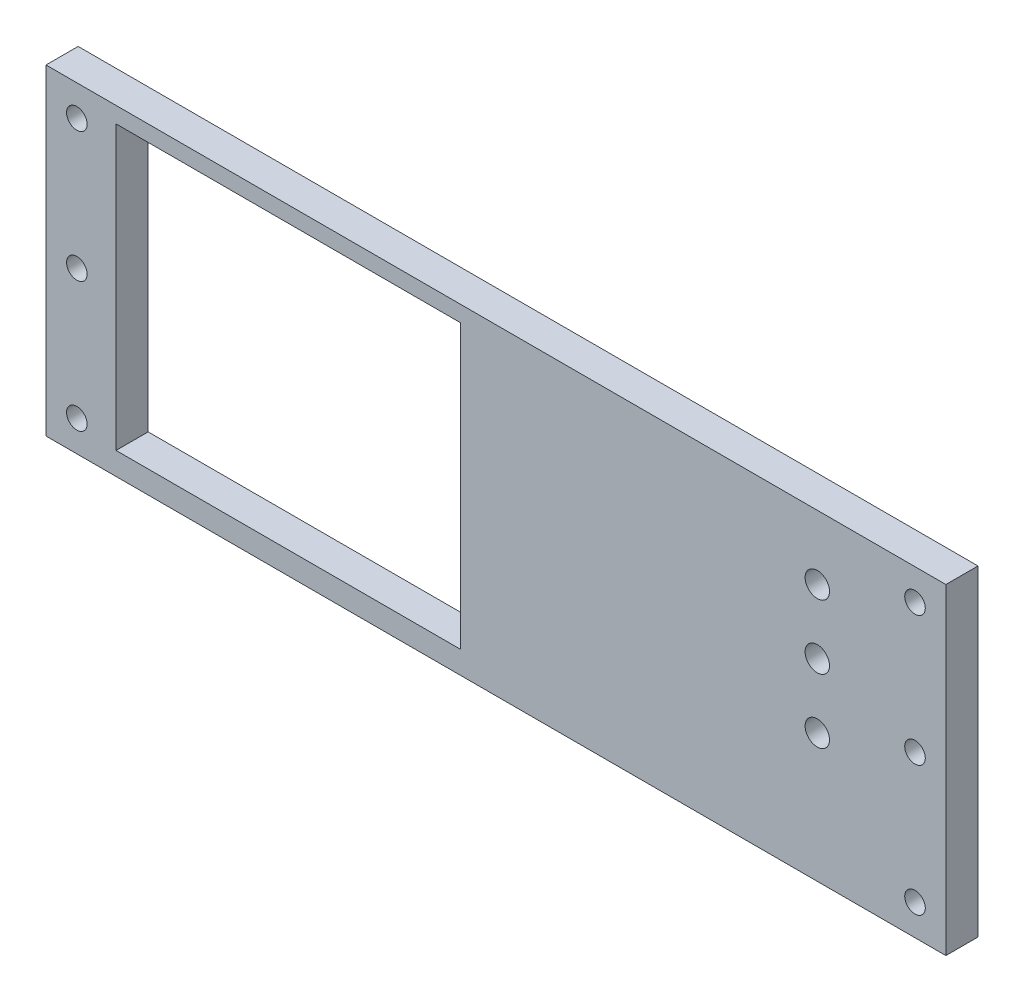
ISO-10303-21;
HEADER;
FILE_DESCRIPTION(('STEP AP214'),'2;1');
FILE_NAME('part.step','',(''),(''),'','','');
FILE_SCHEMA(('AUTOMOTIVE_DESIGN { 1 0 10303 214 1 1 1 1 }'));
ENDSEC;
DATA;
#1=APPLICATION_CONTEXT('core data for automotive mechanical design processes');
#2=APPLICATION_PROTOCOL_DEFINITION('international standard','automotive_design',2000,#1);
#3=PRODUCT_CONTEXT('',#1,'mechanical');
#4=PRODUCT('Part','Part','',(#3));
#5=PRODUCT_RELATED_PRODUCT_CATEGORY('part','',(#4));
#6=PRODUCT_DEFINITION_FORMATION('','',#4);
#7=PRODUCT_DEFINITION_CONTEXT('part definition',#1,'design');
#8=PRODUCT_DEFINITION('design','',#6,#7);
#9=PRODUCT_DEFINITION_SHAPE('','',#8);
#10=(LENGTH_UNIT() NAMED_UNIT(*) SI_UNIT(.MILLI.,.METRE.));
#11=(NAMED_UNIT(*) PLANE_ANGLE_UNIT() SI_UNIT($,.RADIAN.));
#12=(NAMED_UNIT(*) SI_UNIT($,.STERADIAN.) SOLID_ANGLE_UNIT());
#13=UNCERTAINTY_MEASURE_WITH_UNIT(LENGTH_MEASURE(1.E-05),#10,'distance_accuracy_value','');
#14=(GEOMETRIC_REPRESENTATION_CONTEXT(3) GLOBAL_UNCERTAINTY_ASSIGNED_CONTEXT((#13)) GLOBAL_UNIT_ASSIGNED_CONTEXT((#10,
#11,#12)) REPRESENTATION_CONTEXT('',''));
#15=CARTESIAN_POINT('',(0.,0.,0.));
#16=DIRECTION('',(0.,0.,1.));
#17=DIRECTION('',(1.,0.,0.));
#18=AXIS2_PLACEMENT_3D('',#15,#16,#17);
#19=CARTESIAN_POINT('',(63.5,-6.35000000000002,0.));
#20=DIRECTION('',(0.,0.,1.));
#21=DIRECTION('',(1.,0.,0.));
#22=AXIS2_PLACEMENT_3D('',#19,#20,#21);
#23=CYLINDRICAL_SURFACE('',#22,2.413);
#24=CARTESIAN_POINT('',(63.5,-6.35000000000002,0.));
#25=DIRECTION('',(0.,0.,1.));
#26=DIRECTION('',(1.,0.,0.));
#27=AXIS2_PLACEMENT_3D('',#24,#25,#26);
#28=CIRCLE('',#27,2.413);
#29=CARTESIAN_POINT('',(65.913,-6.35000000000002,0.));
#30=VERTEX_POINT('',#29);
#31=EDGE_CURVE('E45',#30,#30,#28,.T.);
#32=ORIENTED_EDGE('',*,*,#31,.F.);
#33=EDGE_LOOP('',(#32));
#34=FACE_BOUND('',#33,.T.);
#35=CARTESIAN_POINT('',(63.5,-6.35000000000002,6.35));
#36=DIRECTION('',(0.,0.,1.));
#37=DIRECTION('',(1.,0.,0.));
#38=AXIS2_PLACEMENT_3D('',#35,#36,#37);
#39=CIRCLE('',#38,2.413);
#40=CARTESIAN_POINT('',(65.913,-6.35000000000002,6.35));
#41=VERTEX_POINT('',#40);
#42=EDGE_CURVE('E12',#41,#41,#39,.T.);
#43=ORIENTED_EDGE('',*,*,#42,.T.);
#44=EDGE_LOOP('',(#43));
#45=FACE_BOUND('',#44,.T.);
#46=ADVANCED_FACE('F38',(#34,#45),#23,.F.);
#47=CARTESIAN_POINT('',(0.,-31.75,6.35));
#48=DIRECTION('',(0.,1.,0.));
#49=DIRECTION('',(0.,0.,1.));
#50=AXIS2_PLACEMENT_3D('',#47,#48,#49);
#51=PLANE('',#50);
#52=DIRECTION('',(1.,0.,0.));
#53=VECTOR('',#52,1.);
#54=CARTESIAN_POINT('',(0.,-31.75,0.));
#55=LINE('',#54,#53);
#56=CARTESIAN_POINT('',(-88.9,-31.75,0.));
#57=VERTEX_POINT('',#56);
#58=CARTESIAN_POINT('',(88.9,-31.75,0.));
#59=VERTEX_POINT('',#58);
#60=EDGE_CURVE('E185',#57,#59,#55,.T.);
#61=ORIENTED_EDGE('',*,*,#60,.T.);
#62=DIRECTION('',(0.,0.,-1.));
#63=VECTOR('',#62,1.);
#64=CARTESIAN_POINT('',(88.9,-31.75,6.35));
#65=LINE('',#64,#63);
#66=CARTESIAN_POINT('',(88.9,-31.75,6.35));
#67=VERTEX_POINT('',#66);
#68=EDGE_CURVE('E216',#67,#59,#65,.T.);
#69=ORIENTED_EDGE('',*,*,#68,.F.);
#70=DIRECTION('',(1.,0.,0.));
#71=VECTOR('',#70,1.);
#72=CARTESIAN_POINT('',(0.,-31.75,6.35));
#73=LINE('',#72,#71);
#74=CARTESIAN_POINT('',(-88.9,-31.75,6.35));
#75=VERTEX_POINT('',#74);
#76=EDGE_CURVE('E144',#75,#67,#73,.T.);
#77=ORIENTED_EDGE('',*,*,#76,.F.);
#78=DIRECTION('',(0.,0.,-1.));
#79=VECTOR('',#78,1.);
#80=CARTESIAN_POINT('',(-88.9,-31.75,6.35));
#81=LINE('',#80,#79);
#82=EDGE_CURVE('E182',#75,#57,#81,.T.);
#83=ORIENTED_EDGE('',*,*,#82,.T.);
#84=EDGE_LOOP('',(#61,#69,#77,#83));
#85=FACE_BOUND('',#84,.T.);
#86=ADVANCED_FACE('F224',(#85),#51,.F.);
#87=CARTESIAN_POINT('',(88.9,0.,6.35));
#88=DIRECTION('',(-1.,0.,0.));
#89=DIRECTION('',(0.,0.,1.));
#90=AXIS2_PLACEMENT_3D('',#87,#88,#89);
#91=PLANE('',#90);
#92=DIRECTION('',(0.,1.,0.));
#93=VECTOR('',#92,1.);
#94=CARTESIAN_POINT('',(88.9,0.,0.));
#95=LINE('',#94,#93);
#96=CARTESIAN_POINT('',(88.9,31.75,0.));
#97=VERTEX_POINT('',#96);
#98=EDGE_CURVE('E188',#59,#97,#95,.T.);
#99=ORIENTED_EDGE('',*,*,#98,.T.);
#100=DIRECTION('',(0.,0.,-1.));
#101=VECTOR('',#100,1.);
#102=CARTESIAN_POINT('',(88.9,31.75,6.35));
#103=LINE('',#102,#101);
#104=CARTESIAN_POINT('',(88.9,31.75,6.35));
#105=VERTEX_POINT('',#104);
#106=EDGE_CURVE('E214',#105,#97,#103,.T.);
#107=ORIENTED_EDGE('',*,*,#106,.F.);
#108=DIRECTION('',(0.,1.,0.));
#109=VECTOR('',#108,1.);
#110=CARTESIAN_POINT('',(88.9,0.,6.35));
#111=LINE('',#110,#109);
#112=EDGE_CURVE('E149',#67,#105,#111,.T.);
#113=ORIENTED_EDGE('',*,*,#112,.F.);
#114=ORIENTED_EDGE('',*,*,#68,.T.);
#115=EDGE_LOOP('',(#99,#107,#113,#114));
#116=FACE_BOUND('',#115,.T.);
#117=ADVANCED_FACE('F270',(#116),#91,.F.);
#118=CARTESIAN_POINT('',(0.,31.75,6.35));
#119=DIRECTION('',(0.,1.,0.));
#120=DIRECTION('',(0.,0.,1.));
#121=AXIS2_PLACEMENT_3D('',#118,#119,#120);
#122=PLANE('',#121);
#123=DIRECTION('',(1.,0.,0.));
#124=VECTOR('',#123,1.);
#125=CARTESIAN_POINT('',(0.,31.75,0.));
#126=LINE('',#125,#124);
#127=CARTESIAN_POINT('',(-88.9,31.75,0.));
#128=VERTEX_POINT('',#127);
#129=EDGE_CURVE('E191',#128,#97,#126,.T.);
#130=ORIENTED_EDGE('',*,*,#129,.F.);
#131=DIRECTION('',(0.,0.,-1.));
#132=VECTOR('',#131,1.);
#133=CARTESIAN_POINT('',(-88.9,31.75,6.35));
#134=LINE('',#133,#132);
#135=CARTESIAN_POINT('',(-88.9,31.75,6.35));
#136=VERTEX_POINT('',#135);
#137=EDGE_CURVE('E212',#136,#128,#134,.T.);
#138=ORIENTED_EDGE('',*,*,#137,.F.);
#139=DIRECTION('',(1.,0.,0.));
#140=VECTOR('',#139,1.);
#141=CARTESIAN_POINT('',(0.,31.75,6.35));
#142=LINE('',#141,#140);
#143=EDGE_CURVE('E158',#136,#105,#142,.T.);
#144=ORIENTED_EDGE('',*,*,#143,.T.);
#145=ORIENTED_EDGE('',*,*,#106,.T.);
#146=EDGE_LOOP('',(#130,#138,#144,#145));
#147=FACE_BOUND('',#146,.T.);
#148=ADVANCED_FACE('F251',(#147),#122,.T.);
#149=CARTESIAN_POINT('',(82.8039999999995,-25.654,6.35));
#150=DIRECTION('',(0.,0.,-1.));
#151=DIRECTION('',(-1.,0.,0.));
#152=AXIS2_PLACEMENT_3D('',#149,#150,#151);
#153=CYLINDRICAL_SURFACE('',#152,2.03200000000001);
#154=CARTESIAN_POINT('',(82.8039999999995,-25.654,6.35));
#155=DIRECTION('',(0.,0.,1.));
#156=DIRECTION('',(1.,0.,0.));
#157=AXIS2_PLACEMENT_3D('',#154,#155,#156);
#158=CIRCLE('',#157,2.03200000000001);
#159=CARTESIAN_POINT('',(84.8359999999995,-25.654,6.35));
#160=VERTEX_POINT('',#159);
#161=EDGE_CURVE('E176',#160,#160,#158,.F.);
#162=ORIENTED_EDGE('',*,*,#161,.F.);
#163=EDGE_LOOP('',(#162));
#164=FACE_BOUND('',#163,.T.);
#165=CARTESIAN_POINT('',(82.8039999999995,-25.654,0.));
#166=DIRECTION('',(0.,0.,1.));
#167=DIRECTION('',(1.,0.,0.));
#168=AXIS2_PLACEMENT_3D('',#165,#166,#167);
#169=CIRCLE('',#168,2.03200000000001);
#170=CARTESIAN_POINT('',(84.8359999999995,-25.654,0.));
#171=VERTEX_POINT('',#170);
#172=EDGE_CURVE('E206',#171,#171,#169,.F.);
#173=ORIENTED_EDGE('',*,*,#172,.T.);
#174=EDGE_LOOP('',(#173));
#175=FACE_BOUND('',#174,.T.);
#176=ADVANCED_FACE('F247',(#164,#175),#153,.F.);
#177=CARTESIAN_POINT('',(-82.8039999999995,-25.654,6.35));
#178=DIRECTION('',(0.,0.,-1.));
#179=DIRECTION('',(-1.,0.,0.));
#180=AXIS2_PLACEMENT_3D('',#177,#178,#179);
#181=CYLINDRICAL_SURFACE('',#180,2.03200000000001);
#182=CARTESIAN_POINT('',(-82.8039999999995,-25.654,6.35));
#183=DIRECTION('',(0.,0.,1.));
#184=DIRECTION('',(1.,0.,0.));
#185=AXIS2_PLACEMENT_3D('',#182,#183,#184);
#186=CIRCLE('',#185,2.03200000000001);
#187=CARTESIAN_POINT('',(-80.7719999999995,-25.654,6.35));
#188=VERTEX_POINT('',#187);
#189=EDGE_CURVE('E172',#188,#188,#186,.T.);
#190=ORIENTED_EDGE('',*,*,#189,.T.);
#191=EDGE_LOOP('',(#190));
#192=FACE_BOUND('',#191,.T.);
#193=CARTESIAN_POINT('',(-82.8039999999995,-25.654,0.));
#194=DIRECTION('',(0.,0.,1.));
#195=DIRECTION('',(1.,0.,0.));
#196=AXIS2_PLACEMENT_3D('',#193,#194,#195);
#197=CIRCLE('',#196,2.03200000000001);
#198=CARTESIAN_POINT('',(-80.7719999999995,-25.654,0.));
#199=VERTEX_POINT('',#198);
#200=EDGE_CURVE('E203',#199,#199,#197,.T.);
#201=ORIENTED_EDGE('',*,*,#200,.F.);
#202=EDGE_LOOP('',(#201));
#203=FACE_BOUND('',#202,.T.);
#204=ADVANCED_FACE('F250',(#192,#203),#181,.F.);
#205=CARTESIAN_POINT('',(-82.8039999999997,0.,6.35));
#206=DIRECTION('',(0.,0.,-1.));
#207=DIRECTION('',(-1.,0.,0.));
#208=AXIS2_PLACEMENT_3D('',#205,#206,#207);
#209=CYLINDRICAL_SURFACE('',#208,2.03200000000001);
#210=CARTESIAN_POINT('',(-82.8039999999997,0.,6.35));
#211=DIRECTION('',(0.,0.,1.));
#212=DIRECTION('',(1.,0.,0.));
#213=AXIS2_PLACEMENT_3D('',#210,#211,#212);
#214=CIRCLE('',#213,2.03200000000001);
#215=CARTESIAN_POINT('',(-80.7719999999997,0.,6.35));
#216=VERTEX_POINT('',#215);
#217=EDGE_CURVE('E169',#216,#216,#214,.T.);
#218=ORIENTED_EDGE('',*,*,#217,.T.);
#219=EDGE_LOOP('',(#218));
#220=FACE_BOUND('',#219,.T.);
#221=CARTESIAN_POINT('',(-82.8039999999997,0.,0.));
#222=DIRECTION('',(0.,0.,1.));
#223=DIRECTION('',(1.,0.,0.));
#224=AXIS2_PLACEMENT_3D('',#221,#222,#223);
#225=CIRCLE('',#224,2.03200000000001);
#226=CARTESIAN_POINT('',(-80.7719999999997,0.,0.));
#227=VERTEX_POINT('',#226);
#228=EDGE_CURVE('E200',#227,#227,#225,.T.);
#229=ORIENTED_EDGE('',*,*,#228,.F.);
#230=EDGE_LOOP('',(#229));
#231=FACE_BOUND('',#230,.T.);
#232=ADVANCED_FACE('F255',(#220,#231),#209,.F.);
#233=CARTESIAN_POINT('',(-82.804,25.654,6.35));
#234=DIRECTION('',(0.,0.,-1.));
#235=DIRECTION('',(-1.,0.,0.));
#236=AXIS2_PLACEMENT_3D('',#233,#234,#235);
#237=CYLINDRICAL_SURFACE('',#236,2.03200000000001);
#238=CARTESIAN_POINT('',(-82.804,25.654,6.35));
#239=DIRECTION('',(0.,0.,1.));
#240=DIRECTION('',(1.,0.,0.));
#241=AXIS2_PLACEMENT_3D('',#238,#239,#240);
#242=CIRCLE('',#241,2.03200000000001);
#243=CARTESIAN_POINT('',(-80.772,25.654,6.35));
#244=VERTEX_POINT('',#243);
#245=EDGE_CURVE('E165',#244,#244,#242,.T.);
#246=ORIENTED_EDGE('',*,*,#245,.T.);
#247=EDGE_LOOP('',(#246));
#248=FACE_BOUND('',#247,.T.);
#249=CARTESIAN_POINT('',(-82.804,25.654,0.));
#250=DIRECTION('',(0.,0.,1.));
#251=DIRECTION('',(1.,0.,0.));
#252=AXIS2_PLACEMENT_3D('',#249,#250,#251);
#253=CIRCLE('',#252,2.03200000000001);
#254=CARTESIAN_POINT('',(-80.772,25.654,0.));
#255=VERTEX_POINT('',#254);
#256=EDGE_CURVE('E197',#255,#255,#253,.T.);
#257=ORIENTED_EDGE('',*,*,#256,.F.);
#258=EDGE_LOOP('',(#257));
#259=FACE_BOUND('',#258,.T.);
#260=ADVANCED_FACE('F259',(#248,#259),#237,.F.);
#261=CARTESIAN_POINT('',(-88.9,0.,6.35));
#262=DIRECTION('',(-1.,0.,0.));
#263=DIRECTION('',(0.,0.,1.));
#264=AXIS2_PLACEMENT_3D('',#261,#262,#263);
#265=PLANE('',#264);
#266=DIRECTION('',(0.,1.,0.));
#267=VECTOR('',#266,1.);
#268=CARTESIAN_POINT('',(-88.9,0.,0.));
#269=LINE('',#268,#267);
#270=EDGE_CURVE('E194',#57,#128,#269,.T.);
#271=ORIENTED_EDGE('',*,*,#270,.F.);
#272=ORIENTED_EDGE('',*,*,#82,.F.);
#273=DIRECTION('',(0.,1.,0.));
#274=VECTOR('',#273,1.);
#275=CARTESIAN_POINT('',(-88.9,0.,6.35));
#276=LINE('',#275,#274);
#277=EDGE_CURVE('E161',#75,#136,#276,.T.);
#278=ORIENTED_EDGE('',*,*,#277,.T.);
#279=ORIENTED_EDGE('',*,*,#137,.T.);
#280=EDGE_LOOP('',(#271,#272,#278,#279));
#281=FACE_BOUND('',#280,.T.);
#282=ADVANCED_FACE('F263',(#281),#265,.T.);
#283=CARTESIAN_POINT('',(82.8039999999997,0.,6.35));
#284=DIRECTION('',(0.,0.,-1.));
#285=DIRECTION('',(-1.,0.,0.));
#286=AXIS2_PLACEMENT_3D('',#283,#284,#285);
#287=CYLINDRICAL_SURFACE('',#286,2.03200000000001);
#288=CARTESIAN_POINT('',(82.8039999999997,0.,6.35));
#289=DIRECTION('',(0.,0.,1.));
#290=DIRECTION('',(1.,0.,0.));
#291=AXIS2_PLACEMENT_3D('',#288,#289,#290);
#292=CIRCLE('',#291,2.03200000000001);
#293=CARTESIAN_POINT('',(84.8359999999997,0.,6.35));
#294=VERTEX_POINT('',#293);
#295=EDGE_CURVE('E141',#294,#294,#292,.F.);
#296=ORIENTED_EDGE('',*,*,#295,.F.);
#297=EDGE_LOOP('',(#296));
#298=FACE_BOUND('',#297,.T.);
#299=CARTESIAN_POINT('',(82.8039999999997,0.,0.));
#300=DIRECTION('',(0.,0.,1.));
#301=DIRECTION('',(1.,0.,0.));
#302=AXIS2_PLACEMENT_3D('',#299,#300,#301);
#303=CIRCLE('',#302,2.03200000000001);
#304=CARTESIAN_POINT('',(84.8359999999997,0.,0.));
#305=VERTEX_POINT('',#304);
#306=EDGE_CURVE('E137',#305,#305,#303,.F.);
#307=ORIENTED_EDGE('',*,*,#306,.T.);
#308=EDGE_LOOP('',(#307));
#309=FACE_BOUND('',#308,.T.);
#310=ADVANCED_FACE('F239',(#298,#309),#287,.F.);
#311=CARTESIAN_POINT('',(82.804,25.654,6.35));
#312=DIRECTION('',(0.,0.,-1.));
#313=DIRECTION('',(-1.,0.,0.));
#314=AXIS2_PLACEMENT_3D('',#311,#312,#313);
#315=CYLINDRICAL_SURFACE('',#314,2.03200000000001);
#316=CARTESIAN_POINT('',(82.804,25.654,6.35));
#317=DIRECTION('',(0.,0.,1.));
#318=DIRECTION('',(1.,0.,0.));
#319=AXIS2_PLACEMENT_3D('',#316,#317,#318);
#320=CIRCLE('',#319,2.03200000000001);
#321=CARTESIAN_POINT('',(84.836,25.654,6.35));
#322=VERTEX_POINT('',#321);
#323=EDGE_CURVE('E179',#322,#322,#320,.F.);
#324=ORIENTED_EDGE('',*,*,#323,.F.);
#325=EDGE_LOOP('',(#324));
#326=FACE_BOUND('',#325,.T.);
#327=CARTESIAN_POINT('',(82.804,25.654,0.));
#328=DIRECTION('',(0.,0.,1.));
#329=DIRECTION('',(1.,0.,0.));
#330=AXIS2_PLACEMENT_3D('',#327,#328,#329);
#331=CIRCLE('',#330,2.03200000000001);
#332=CARTESIAN_POINT('',(84.836,25.654,0.));
#333=VERTEX_POINT('',#332);
#334=EDGE_CURVE('E145',#333,#333,#331,.F.);
#335=ORIENTED_EDGE('',*,*,#334,.T.);
#336=EDGE_LOOP('',(#335));
#337=FACE_BOUND('',#336,.T.);
#338=ADVANCED_FACE('F229',(#326,#337),#315,.F.);
#339=CARTESIAN_POINT('',(0.,0.,6.35));
#340=DIRECTION('',(0.,0.,1.));
#341=DIRECTION('',(1.,0.,0.));
#342=AXIS2_PLACEMENT_3D('',#339,#340,#341);
#343=PLANE('',#342);
#344=CARTESIAN_POINT('',(63.5,6.34999999999998,6.35));
#345=DIRECTION('',(0.,0.,1.));
#346=DIRECTION('',(1.,0.,0.));
#347=AXIS2_PLACEMENT_3D('',#344,#345,#346);
#348=CIRCLE('',#347,2.413);
#349=CARTESIAN_POINT('',(65.913,6.34999999999998,6.35));
#350=VERTEX_POINT('',#349);
#351=EDGE_CURVE('E402',#350,#350,#348,.T.);
#352=ORIENTED_EDGE('',*,*,#351,.F.);
#353=EDGE_LOOP('',(#352));
#354=FACE_BOUND('',#353,.T.);
#355=CARTESIAN_POINT('',(63.5,19.05,6.35));
#356=DIRECTION('',(0.,0.,1.));
#357=DIRECTION('',(1.,0.,0.));
#358=AXIS2_PLACEMENT_3D('',#355,#356,#357);
#359=CIRCLE('',#358,2.413);
#360=CARTESIAN_POINT('',(65.913,19.05,6.35));
#361=VERTEX_POINT('',#360);
#362=EDGE_CURVE('E124',#361,#361,#359,.T.);
#363=ORIENTED_EDGE('',*,*,#362,.F.);
#364=EDGE_LOOP('',(#363));
#365=FACE_BOUND('',#364,.T.);
#366=DIRECTION('',(1.,0.,0.));
#367=VECTOR('',#366,1.);
#368=CARTESIAN_POINT('',(0.,-27.2904709288165,6.35));
#369=LINE('',#368,#367);
#370=CARTESIAN_POINT('',(-75.0631835888811,-27.2904709288165,6.35));
#371=VERTEX_POINT('',#370);
#372=CARTESIAN_POINT('',(-7.03193606446462,-27.2904709288165,6.35));
#373=VERTEX_POINT('',#372);
#374=EDGE_CURVE('E52',#371,#373,#369,.T.);
#375=ORIENTED_EDGE('',*,*,#374,.F.);
#376=DIRECTION('',(0.,1.,0.));
#377=VECTOR('',#376,1.);
#378=CARTESIAN_POINT('',(-75.0631835888811,0.,6.35));
#379=LINE('',#378,#377);
#380=CARTESIAN_POINT('',(-75.0631835888811,28.5895290711835,6.35));
#381=VERTEX_POINT('',#380);
#382=EDGE_CURVE('E118',#371,#381,#379,.T.);
#383=ORIENTED_EDGE('',*,*,#382,.T.);
#384=DIRECTION('',(1.,0.,0.));
#385=VECTOR('',#384,1.);
#386=CARTESIAN_POINT('',(0.,28.5895290711835,6.35));
#387=LINE('',#386,#385);
#388=CARTESIAN_POINT('',(-7.03193606446462,28.5895290711835,6.35));
#389=VERTEX_POINT('',#388);
#390=EDGE_CURVE('E121',#381,#389,#387,.T.);
#391=ORIENTED_EDGE('',*,*,#390,.T.);
#392=DIRECTION('',(0.,1.,0.));
#393=VECTOR('',#392,1.);
#394=CARTESIAN_POINT('',(-7.03193606446462,0.,6.35));
#395=LINE('',#394,#393);
#396=EDGE_CURVE('E130',#373,#389,#395,.T.);
#397=ORIENTED_EDGE('',*,*,#396,.F.);
#398=EDGE_LOOP('',(#375,#383,#391,#397));
#399=FACE_BOUND('',#398,.T.);
#400=ORIENTED_EDGE('',*,*,#295,.T.);
#401=EDGE_LOOP('',(#400));
#402=FACE_BOUND('',#401,.T.);
#403=ORIENTED_EDGE('',*,*,#76,.T.);
#404=ORIENTED_EDGE('',*,*,#112,.T.);
#405=ORIENTED_EDGE('',*,*,#143,.F.);
#406=ORIENTED_EDGE('',*,*,#277,.F.);
#407=EDGE_LOOP('',(#403,#404,#405,#406));
#408=FACE_BOUND('',#407,.T.);
#409=ORIENTED_EDGE('',*,*,#245,.F.);
#410=EDGE_LOOP('',(#409));
#411=FACE_BOUND('',#410,.T.);
#412=ORIENTED_EDGE('',*,*,#217,.F.);
#413=EDGE_LOOP('',(#412));
#414=FACE_BOUND('',#413,.T.);
#415=ORIENTED_EDGE('',*,*,#189,.F.);
#416=EDGE_LOOP('',(#415));
#417=FACE_BOUND('',#416,.T.);
#418=ORIENTED_EDGE('',*,*,#161,.T.);
#419=EDGE_LOOP('',(#418));
#420=FACE_BOUND('',#419,.T.);
#421=ORIENTED_EDGE('',*,*,#323,.T.);
#422=EDGE_LOOP('',(#421));
#423=FACE_BOUND('',#422,.T.);
#424=ORIENTED_EDGE('',*,*,#42,.F.);
#425=EDGE_LOOP('',(#424));
#426=FACE_BOUND('',#425,.T.);
#427=ADVANCED_FACE('F227',(#354,#365,#399,#402,#408,#411,#414,#417,#420,#423,#426),#343,.T.);
#428=CARTESIAN_POINT('',(0.,0.,0.));
#429=DIRECTION('',(0.,0.,1.));
#430=DIRECTION('',(1.,0.,0.));
#431=AXIS2_PLACEMENT_3D('',#428,#429,#430);
#432=PLANE('',#431);
#433=CARTESIAN_POINT('',(63.5,6.34999999999998,0.));
#434=DIRECTION('',(0.,0.,1.));
#435=DIRECTION('',(1.,0.,0.));
#436=AXIS2_PLACEMENT_3D('',#433,#434,#435);
#437=CIRCLE('',#436,2.413);
#438=CARTESIAN_POINT('',(65.913,6.34999999999998,0.));
#439=VERTEX_POINT('',#438);
#440=EDGE_CURVE('E400',#439,#439,#437,.T.);
#441=ORIENTED_EDGE('',*,*,#440,.T.);
#442=EDGE_LOOP('',(#441));
#443=FACE_BOUND('',#442,.T.);
#444=CARTESIAN_POINT('',(63.5,19.05,0.));
#445=DIRECTION('',(0.,0.,1.));
#446=DIRECTION('',(1.,0.,0.));
#447=AXIS2_PLACEMENT_3D('',#444,#445,#446);
#448=CIRCLE('',#447,2.413);
#449=CARTESIAN_POINT('',(65.913,19.05,0.));
#450=VERTEX_POINT('',#449);
#451=EDGE_CURVE('E131',#450,#450,#448,.T.);
#452=ORIENTED_EDGE('',*,*,#451,.T.);
#453=EDGE_LOOP('',(#452));
#454=FACE_BOUND('',#453,.T.);
#455=DIRECTION('',(0.,1.,0.));
#456=VECTOR('',#455,1.);
#457=CARTESIAN_POINT('',(-75.0631835888811,0.,0.));
#458=LINE('',#457,#456);
#459=CARTESIAN_POINT('',(-75.0631835888811,-27.2904709288165,0.));
#460=VERTEX_POINT('',#459);
#461=CARTESIAN_POINT('',(-75.0631835888811,28.5895290711835,0.));
#462=VERTEX_POINT('',#461);
#463=EDGE_CURVE('E107',#460,#462,#458,.T.);
#464=ORIENTED_EDGE('',*,*,#463,.F.);
#465=DIRECTION('',(1.,0.,0.));
#466=VECTOR('',#465,1.);
#467=CARTESIAN_POINT('',(0.,-27.2904709288165,0.));
#468=LINE('',#467,#466);
#469=CARTESIAN_POINT('',(-7.03193606446462,-27.2904709288165,0.));
#470=VERTEX_POINT('',#469);
#471=EDGE_CURVE('E104',#460,#470,#468,.T.);
#472=ORIENTED_EDGE('',*,*,#471,.T.);
#473=DIRECTION('',(0.,1.,0.));
#474=VECTOR('',#473,1.);
#475=CARTESIAN_POINT('',(-7.03193606446462,0.,0.));
#476=LINE('',#475,#474);
#477=CARTESIAN_POINT('',(-7.03193606446462,28.5895290711835,0.));
#478=VERTEX_POINT('',#477);
#479=EDGE_CURVE('E110',#470,#478,#476,.T.);
#480=ORIENTED_EDGE('',*,*,#479,.T.);
#481=DIRECTION('',(1.,0.,0.));
#482=VECTOR('',#481,1.);
#483=CARTESIAN_POINT('',(0.,28.5895290711835,0.));
#484=LINE('',#483,#482);
#485=EDGE_CURVE('E114',#462,#478,#484,.T.);
#486=ORIENTED_EDGE('',*,*,#485,.F.);
#487=EDGE_LOOP('',(#464,#472,#480,#486));
#488=FACE_BOUND('',#487,.T.);
#489=ORIENTED_EDGE('',*,*,#306,.F.);
#490=EDGE_LOOP('',(#489));
#491=FACE_BOUND('',#490,.T.);
#492=ORIENTED_EDGE('',*,*,#60,.F.);
#493=ORIENTED_EDGE('',*,*,#270,.T.);
#494=ORIENTED_EDGE('',*,*,#129,.T.);
#495=ORIENTED_EDGE('',*,*,#98,.F.);
#496=EDGE_LOOP('',(#492,#493,#494,#495));
#497=FACE_BOUND('',#496,.T.);
#498=ORIENTED_EDGE('',*,*,#256,.T.);
#499=EDGE_LOOP('',(#498));
#500=FACE_BOUND('',#499,.T.);
#501=ORIENTED_EDGE('',*,*,#228,.T.);
#502=EDGE_LOOP('',(#501));
#503=FACE_BOUND('',#502,.T.);
#504=ORIENTED_EDGE('',*,*,#200,.T.);
#505=EDGE_LOOP('',(#504));
#506=FACE_BOUND('',#505,.T.);
#507=ORIENTED_EDGE('',*,*,#172,.F.);
#508=EDGE_LOOP('',(#507));
#509=FACE_BOUND('',#508,.T.);
#510=ORIENTED_EDGE('',*,*,#334,.F.);
#511=EDGE_LOOP('',(#510));
#512=FACE_BOUND('',#511,.T.);
#513=ORIENTED_EDGE('',*,*,#31,.T.);
#514=EDGE_LOOP('',(#513));
#515=FACE_BOUND('',#514,.T.);
#516=ADVANCED_FACE('F116',(#443,#454,#488,#491,#497,#500,#503,#506,#509,#512,#515),#432,.F.);
#517=CARTESIAN_POINT('',(0.,-27.2904709288165,0.));
#518=DIRECTION('',(0.,-1.,0.));
#519=DIRECTION('',(0.,0.,-1.));
#520=AXIS2_PLACEMENT_3D('',#517,#518,#519);
#521=PLANE('',#520);
#522=ORIENTED_EDGE('',*,*,#374,.T.);
#523=DIRECTION('',(0.,0.,1.));
#524=VECTOR('',#523,1.);
#525=CARTESIAN_POINT('',(-7.03193606446462,-27.2904709288165,0.));
#526=LINE('',#525,#524);
#527=EDGE_CURVE('E101',#470,#373,#526,.T.);
#528=ORIENTED_EDGE('',*,*,#527,.F.);
#529=ORIENTED_EDGE('',*,*,#471,.F.);
#530=DIRECTION('',(0.,0.,1.));
#531=VECTOR('',#530,1.);
#532=CARTESIAN_POINT('',(-75.0631835888811,-27.2904709288165,0.));
#533=LINE('',#532,#531);
#534=EDGE_CURVE('E135',#460,#371,#533,.T.);
#535=ORIENTED_EDGE('',*,*,#534,.T.);
#536=EDGE_LOOP('',(#522,#528,#529,#535));
#537=FACE_BOUND('',#536,.T.);
#538=ADVANCED_FACE('F102',(#537),#521,.F.);
#539=CARTESIAN_POINT('',(-75.0631835888811,0.,0.));
#540=DIRECTION('',(1.,0.,0.));
#541=DIRECTION('',(0.,0.,-1.));
#542=AXIS2_PLACEMENT_3D('',#539,#540,#541);
#543=PLANE('',#542);
#544=ORIENTED_EDGE('',*,*,#382,.F.);
#545=ORIENTED_EDGE('',*,*,#534,.F.);
#546=ORIENTED_EDGE('',*,*,#463,.T.);
#547=DIRECTION('',(0.,0.,1.));
#548=VECTOR('',#547,1.);
#549=CARTESIAN_POINT('',(-75.0631835888811,28.5895290711835,0.));
#550=LINE('',#549,#548);
#551=EDGE_CURVE('E138',#462,#381,#550,.T.);
#552=ORIENTED_EDGE('',*,*,#551,.T.);
#553=EDGE_LOOP('',(#544,#545,#546,#552));
#554=FACE_BOUND('',#553,.T.);
#555=ADVANCED_FACE('F344',(#554),#543,.T.);
#556=CARTESIAN_POINT('',(0.,28.5895290711835,0.));
#557=DIRECTION('',(0.,-1.,0.));
#558=DIRECTION('',(0.,0.,-1.));
#559=AXIS2_PLACEMENT_3D('',#556,#557,#558);
#560=PLANE('',#559);
#561=ORIENTED_EDGE('',*,*,#390,.F.);
#562=ORIENTED_EDGE('',*,*,#551,.F.);
#563=ORIENTED_EDGE('',*,*,#485,.T.);
#564=DIRECTION('',(0.,0.,1.));
#565=VECTOR('',#564,1.);
#566=CARTESIAN_POINT('',(-7.03193606446462,28.5895290711835,0.));
#567=LINE('',#566,#565);
#568=EDGE_CURVE('E60',#478,#389,#567,.T.);
#569=ORIENTED_EDGE('',*,*,#568,.T.);
#570=EDGE_LOOP('',(#561,#562,#563,#569));
#571=FACE_BOUND('',#570,.T.);
#572=ADVANCED_FACE('F349',(#571),#560,.T.);
#573=CARTESIAN_POINT('',(-7.03193606446462,0.,0.));
#574=DIRECTION('',(1.,0.,0.));
#575=DIRECTION('',(0.,0.,-1.));
#576=AXIS2_PLACEMENT_3D('',#573,#574,#575);
#577=PLANE('',#576);
#578=ORIENTED_EDGE('',*,*,#396,.T.);
#579=ORIENTED_EDGE('',*,*,#568,.F.);
#580=ORIENTED_EDGE('',*,*,#479,.F.);
#581=ORIENTED_EDGE('',*,*,#527,.T.);
#582=EDGE_LOOP('',(#578,#579,#580,#581));
#583=FACE_BOUND('',#582,.T.);
#584=ADVANCED_FACE('F111',(#583),#577,.F.);
#585=CARTESIAN_POINT('',(63.5,19.05,0.));
#586=DIRECTION('',(0.,0.,1.));
#587=DIRECTION('',(1.,0.,0.));
#588=AXIS2_PLACEMENT_3D('',#585,#586,#587);
#589=CYLINDRICAL_SURFACE('',#588,2.413);
#590=ORIENTED_EDGE('',*,*,#451,.F.);
#591=EDGE_LOOP('',(#590));
#592=FACE_BOUND('',#591,.T.);
#593=ORIENTED_EDGE('',*,*,#362,.T.);
#594=EDGE_LOOP('',(#593));
#595=FACE_BOUND('',#594,.T.);
#596=ADVANCED_FACE('F363',(#592,#595),#589,.F.);
#597=CARTESIAN_POINT('',(63.5,6.34999999999998,0.));
#598=DIRECTION('',(0.,0.,1.));
#599=DIRECTION('',(1.,0.,0.));
#600=AXIS2_PLACEMENT_3D('',#597,#598,#599);
#601=CYLINDRICAL_SURFACE('',#600,2.413);
#602=ORIENTED_EDGE('',*,*,#440,.F.);
#603=EDGE_LOOP('',(#602));
#604=FACE_BOUND('',#603,.T.);
#605=ORIENTED_EDGE('',*,*,#351,.T.);
#606=EDGE_LOOP('',(#605));
#607=FACE_BOUND('',#606,.T.);
#608=ADVANCED_FACE('F373',(#604,#607),#601,.F.);
#609=CLOSED_SHELL('',(#46,#86,#117,#148,#176,#204,#232,#260,#282,#310,#338,#427,#516,#538,#555,
#572,#584,#596,#608));
#610=MANIFOLD_SOLID_BREP('B2',#609);
#611=ADVANCED_BREP_SHAPE_REPRESENTATION('',(#18,#610),#14);
#612=SHAPE_DEFINITION_REPRESENTATION(#9,#611);
ENDSEC;
END-ISO-10303-21;
